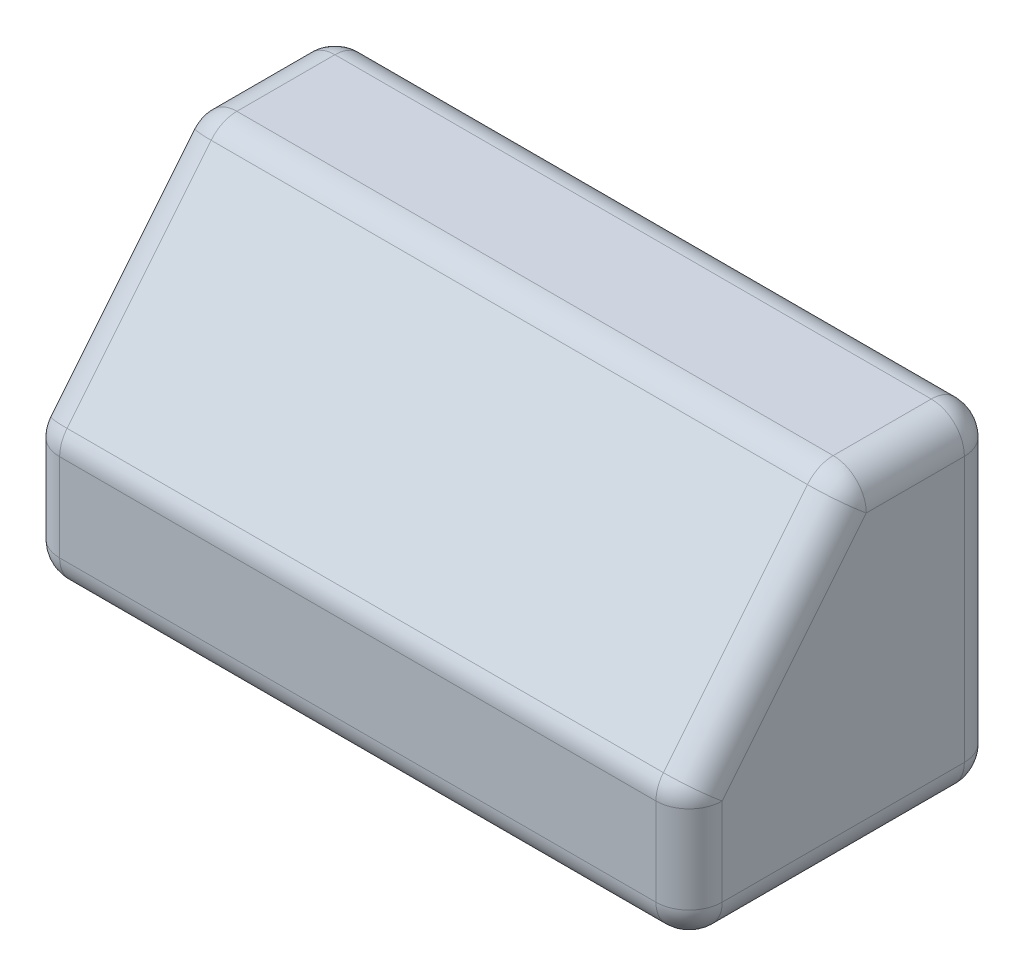
ISO-10303-21;
HEADER;
FILE_DESCRIPTION(('STEP AP214'),'2;1');
FILE_NAME('part.step','',(''),(''),'','','');
FILE_SCHEMA(('AUTOMOTIVE_DESIGN { 1 0 10303 214 1 1 1 1 }'));
ENDSEC;
DATA;
#1=APPLICATION_CONTEXT('core data for automotive mechanical design processes');
#2=APPLICATION_PROTOCOL_DEFINITION('international standard','automotive_design',2000,#1);
#3=PRODUCT_CONTEXT('',#1,'mechanical');
#4=PRODUCT('Part','Part','',(#3));
#5=PRODUCT_RELATED_PRODUCT_CATEGORY('part','',(#4));
#6=PRODUCT_DEFINITION_FORMATION('','',#4);
#7=PRODUCT_DEFINITION_CONTEXT('part definition',#1,'design');
#8=PRODUCT_DEFINITION('design','',#6,#7);
#9=PRODUCT_DEFINITION_SHAPE('','',#8);
#10=(LENGTH_UNIT() NAMED_UNIT(*) SI_UNIT(.MILLI.,.METRE.));
#11=(NAMED_UNIT(*) PLANE_ANGLE_UNIT() SI_UNIT($,.RADIAN.));
#12=(NAMED_UNIT(*) SI_UNIT($,.STERADIAN.) SOLID_ANGLE_UNIT());
#13=UNCERTAINTY_MEASURE_WITH_UNIT(LENGTH_MEASURE(1.E-05),#10,'distance_accuracy_value','');
#14=(GEOMETRIC_REPRESENTATION_CONTEXT(3) GLOBAL_UNCERTAINTY_ASSIGNED_CONTEXT((#13)) GLOBAL_UNIT_ASSIGNED_CONTEXT((#10,
#11,#12)) REPRESENTATION_CONTEXT('',''));
#15=CARTESIAN_POINT('',(0.,0.,0.));
#16=DIRECTION('',(0.,0.,1.));
#17=DIRECTION('',(1.,0.,0.));
#18=AXIS2_PLACEMENT_3D('',#15,#16,#17);
#19=CARTESIAN_POINT('',(127.,140.462,103.680401501193));
#20=DIRECTION('',(0.,0.,-1.));
#21=DIRECTION('',(-1.,0.,0.));
#22=AXIS2_PLACEMENT_3D('',#19,#20,#21);
#23=PLANE('',#22);
#24=DIRECTION('',(0.,-1.,0.));
#25=VECTOR('',#24,1.);
#26=CARTESIAN_POINT('',(-114.3,140.462,103.680401501193));
#27=LINE('',#26,#25);
#28=CARTESIAN_POINT('',(-114.3,135.953726858642,103.680401501193));
#29=VERTEX_POINT('',#28);
#30=CARTESIAN_POINT('',(-114.3,102.362,103.680401501193));
#31=VERTEX_POINT('',#30);
#32=EDGE_CURVE('E182',#29,#31,#27,.T.);
#33=ORIENTED_EDGE('',*,*,#32,.T.);
#34=DIRECTION('',(-1.,0.,0.));
#35=VECTOR('',#34,1.);
#36=CARTESIAN_POINT('',(127.,102.362,103.680401501193));
#37=LINE('',#36,#35);
#38=CARTESIAN_POINT('',(114.3,102.362,103.680401501193));
#39=VERTEX_POINT('',#38);
#40=EDGE_CURVE('E180',#31,#39,#37,.F.);
#41=ORIENTED_EDGE('',*,*,#40,.T.);
#42=DIRECTION('',(0.,-1.,0.));
#43=VECTOR('',#42,1.);
#44=CARTESIAN_POINT('',(114.3,140.462,103.680401501193));
#45=LINE('',#44,#43);
#46=CARTESIAN_POINT('',(114.3,135.953726858642,103.680401501193));
#47=VERTEX_POINT('',#46);
#48=EDGE_CURVE('E173',#39,#47,#45,.F.);
#49=ORIENTED_EDGE('',*,*,#48,.T.);
#50=DIRECTION('',(-1.,0.,0.));
#51=VECTOR('',#50,1.);
#52=CARTESIAN_POINT('',(127.,135.953726858642,103.680401501193));
#53=LINE('',#52,#51);
#54=EDGE_CURVE('E177',#47,#29,#53,.T.);
#55=ORIENTED_EDGE('',*,*,#54,.T.);
#56=EDGE_LOOP('',(#33,#41,#49,#55));
#57=FACE_BOUND('',#56,.T.);
#58=ADVANCED_FACE('F64',(#57),#23,.F.);
#59=CARTESIAN_POINT('',(127.,89.662,103.680401501193));
#60=DIRECTION('',(0.,1.,0.));
#61=DIRECTION('',(0.,0.,1.));
#62=AXIS2_PLACEMENT_3D('',#59,#60,#61);
#63=PLANE('',#62);
#64=DIRECTION('',(0.,0.,-1.));
#65=VECTOR('',#64,1.);
#66=CARTESIAN_POINT('',(-114.3,89.662,103.680401501193));
#67=LINE('',#66,#65);
#68=CARTESIAN_POINT('',(-114.3,89.662,90.9804015011929));
#69=VERTEX_POINT('',#68);
#70=CARTESIAN_POINT('',(-114.3,89.662,-1.84700646578063));
#71=VERTEX_POINT('',#70);
#72=EDGE_CURVE('E227',#69,#71,#67,.T.);
#73=ORIENTED_EDGE('',*,*,#72,.T.);
#74=DIRECTION('',(-1.,0.,0.));
#75=VECTOR('',#74,1.);
#76=CARTESIAN_POINT('',(127.,89.662,-1.84700646578063));
#77=LINE('',#76,#75);
#78=CARTESIAN_POINT('',(114.3,89.662,-1.84700646578063));
#79=VERTEX_POINT('',#78);
#80=EDGE_CURVE('E230',#71,#79,#77,.F.);
#81=ORIENTED_EDGE('',*,*,#80,.T.);
#82=DIRECTION('',(0.,0.,-1.));
#83=VECTOR('',#82,1.);
#84=CARTESIAN_POINT('',(114.3,89.662,103.680401501193));
#85=LINE('',#84,#83);
#86=CARTESIAN_POINT('',(114.3,89.662,90.9804015011929));
#87=VERTEX_POINT('',#86);
#88=EDGE_CURVE('E225',#79,#87,#85,.F.);
#89=ORIENTED_EDGE('',*,*,#88,.T.);
#90=DIRECTION('',(-1.,0.,0.));
#91=VECTOR('',#90,1.);
#92=CARTESIAN_POINT('',(127.,89.662,90.9804015011929));
#93=LINE('',#92,#91);
#94=EDGE_CURVE('E223',#87,#69,#93,.T.);
#95=ORIENTED_EDGE('',*,*,#94,.T.);
#96=EDGE_LOOP('',(#73,#81,#89,#95));
#97=FACE_BOUND('',#96,.T.);
#98=ADVANCED_FACE('F424',(#97),#63,.F.);
#99=CARTESIAN_POINT('',(127.,89.662,-14.5470064657806));
#100=DIRECTION('',(0.,0.,1.));
#101=DIRECTION('',(1.,0.,0.));
#102=AXIS2_PLACEMENT_3D('',#99,#100,#101);
#103=PLANE('',#102);
#104=DIRECTION('',(0.,1.,0.));
#105=VECTOR('',#104,1.);
#106=CARTESIAN_POINT('',(-114.3,89.662,-14.5470064657806));
#107=LINE('',#106,#105);
#108=CARTESIAN_POINT('',(-114.3,102.362,-14.5470064657806));
#109=VERTEX_POINT('',#108);
#110=CARTESIAN_POINT('',(-114.3,203.962,-14.5470064657806));
#111=VERTEX_POINT('',#110);
#112=EDGE_CURVE('E236',#109,#111,#107,.T.);
#113=ORIENTED_EDGE('',*,*,#112,.T.);
#114=DIRECTION('',(-1.,0.,0.));
#115=VECTOR('',#114,1.);
#116=CARTESIAN_POINT('',(127.,203.962,-14.5470064657806));
#117=LINE('',#116,#115);
#118=CARTESIAN_POINT('',(114.3,203.962,-14.5470064657806));
#119=VERTEX_POINT('',#118);
#120=EDGE_CURVE('E239',#111,#119,#117,.F.);
#121=ORIENTED_EDGE('',*,*,#120,.T.);
#122=DIRECTION('',(0.,1.,0.));
#123=VECTOR('',#122,1.);
#124=CARTESIAN_POINT('',(114.3,89.662,-14.5470064657806));
#125=LINE('',#124,#123);
#126=CARTESIAN_POINT('',(114.3,102.362,-14.5470064657806));
#127=VERTEX_POINT('',#126);
#128=EDGE_CURVE('E234',#119,#127,#125,.F.);
#129=ORIENTED_EDGE('',*,*,#128,.T.);
#130=DIRECTION('',(-1.,0.,0.));
#131=VECTOR('',#130,1.);
#132=CARTESIAN_POINT('',(127.,102.362,-14.5470064657806));
#133=LINE('',#132,#131);
#134=EDGE_CURVE('E232',#127,#109,#133,.T.);
#135=ORIENTED_EDGE('',*,*,#134,.T.);
#136=EDGE_LOOP('',(#113,#121,#129,#135));
#137=FACE_BOUND('',#136,.T.);
#138=ADVANCED_FACE('F389',(#137),#103,.F.);
#139=CARTESIAN_POINT('',(127.,216.662,-14.5470064657806));
#140=DIRECTION('',(0.,-1.,0.));
#141=DIRECTION('',(0.,0.,-1.));
#142=AXIS2_PLACEMENT_3D('',#139,#140,#141);
#143=PLANE('',#142);
#144=DIRECTION('',(0.,0.,1.));
#145=VECTOR('',#144,1.);
#146=CARTESIAN_POINT('',(-114.3,216.662,-14.5470064657806));
#147=LINE('',#146,#145);
#148=CARTESIAN_POINT('',(-114.3,216.662,-1.84700646578063));
#149=VERTEX_POINT('',#148);
#150=CARTESIAN_POINT('',(-114.3,216.662,35.7354074828247));
#151=VERTEX_POINT('',#150);
#152=EDGE_CURVE('E245',#149,#151,#147,.T.);
#153=ORIENTED_EDGE('',*,*,#152,.T.);
#154=DIRECTION('',(-1.,0.,0.));
#155=VECTOR('',#154,1.);
#156=CARTESIAN_POINT('',(127.,216.662,35.7354074828247));
#157=LINE('',#156,#155);
#158=CARTESIAN_POINT('',(114.3,216.662,35.7354074828247));
#159=VERTEX_POINT('',#158);
#160=EDGE_CURVE('E248',#151,#159,#157,.F.);
#161=ORIENTED_EDGE('',*,*,#160,.T.);
#162=DIRECTION('',(0.,0.,1.));
#163=VECTOR('',#162,1.);
#164=CARTESIAN_POINT('',(114.3,216.662,-14.5470064657806));
#165=LINE('',#164,#163);
#166=CARTESIAN_POINT('',(114.3,216.662,-1.84700646578063));
#167=VERTEX_POINT('',#166);
#168=EDGE_CURVE('E243',#159,#167,#165,.F.);
#169=ORIENTED_EDGE('',*,*,#168,.T.);
#170=DIRECTION('',(-1.,0.,0.));
#171=VECTOR('',#170,1.);
#172=CARTESIAN_POINT('',(127.,216.662,-1.84700646578063));
#173=LINE('',#172,#171);
#174=EDGE_CURVE('E241',#167,#149,#173,.T.);
#175=ORIENTED_EDGE('',*,*,#174,.T.);
#176=EDGE_LOOP('',(#153,#161,#169,#175));
#177=FACE_BOUND('',#176,.T.);
#178=ADVANCED_FACE('F405',(#177),#143,.F.);
#179=CARTESIAN_POINT('',(127.,216.662,41.7810420592956));
#180=DIRECTION('',(0.,-0.630511996261592,-0.776179504090531));
#181=DIRECTION('',(0.,0.776179504090531,-0.630511996261592));
#182=AXIS2_PLACEMENT_3D('',#179,#180,#181);
#183=PLANE('',#182);
#184=DIRECTION('',(0.,-0.776179504090531,0.630511996261592));
#185=VECTOR('',#184,1.);
#186=CARTESIAN_POINT('',(114.3,216.662,41.7810420592956));
#187=LINE('',#186,#185);
#188=CARTESIAN_POINT('',(114.3,143.961229211164,100.837881203143));
#189=VERTEX_POINT('',#188);
#190=CARTESIAN_POINT('',(114.3,211.969502352522,45.5928871847744));
#191=VERTEX_POINT('',#190);
#192=EDGE_CURVE('E252',#189,#191,#187,.F.);
#193=ORIENTED_EDGE('',*,*,#192,.T.);
#194=DIRECTION('',(-1.,0.,0.));
#195=VECTOR('',#194,1.);
#196=CARTESIAN_POINT('',(127.,211.969502352522,45.5928871847744));
#197=LINE('',#196,#195);
#198=CARTESIAN_POINT('',(-114.3,211.969502352522,45.5928871847744));
#199=VERTEX_POINT('',#198);
#200=EDGE_CURVE('E257',#191,#199,#197,.T.);
#201=ORIENTED_EDGE('',*,*,#200,.T.);
#202=DIRECTION('',(0.,-0.776179504090531,0.630511996261592));
#203=VECTOR('',#202,1.);
#204=CARTESIAN_POINT('',(-114.3,216.662,41.7810420592956));
#205=LINE('',#204,#203);
#206=CARTESIAN_POINT('',(-114.3,143.961229211164,100.837881203143));
#207=VERTEX_POINT('',#206);
#208=EDGE_CURVE('E254',#199,#207,#205,.T.);
#209=ORIENTED_EDGE('',*,*,#208,.T.);
#210=DIRECTION('',(-1.,0.,0.));
#211=VECTOR('',#210,1.);
#212=CARTESIAN_POINT('',(127.,143.961229211164,100.837881203143));
#213=LINE('',#212,#211);
#214=EDGE_CURVE('E250',#207,#189,#213,.F.);
#215=ORIENTED_EDGE('',*,*,#214,.T.);
#216=EDGE_LOOP('',(#193,#201,#209,#215));
#217=FACE_BOUND('',#216,.T.);
#218=ADVANCED_FACE('F351',(#217),#183,.F.);
#219=CARTESIAN_POINT('',(127.,0.,0.));
#220=DIRECTION('',(1.,0.,0.));
#221=DIRECTION('',(0.,0.,-1.));
#222=AXIS2_PLACEMENT_3D('',#219,#220,#221);
#223=PLANE('',#222);
#224=DIRECTION('',(0.,-0.776179504090531,0.630511996261592));
#225=VECTOR('',#224,1.);
#226=CARTESIAN_POINT('',(127.,132.454497647478,93.8229217992432));
#227=LINE('',#226,#225);
#228=CARTESIAN_POINT('',(127.,203.962,35.7354074828247));
#229=VERTEX_POINT('',#228);
#230=CARTESIAN_POINT('',(127.,135.953726858642,90.9804015011929));
#231=VERTEX_POINT('',#230);
#232=EDGE_CURVE('E259',#229,#231,#227,.T.);
#233=ORIENTED_EDGE('',*,*,#232,.T.);
#234=DIRECTION('',(0.,-1.,0.));
#235=VECTOR('',#234,1.);
#236=CARTESIAN_POINT('',(127.,89.662,90.9804015011929));
#237=LINE('',#236,#235);
#238=CARTESIAN_POINT('',(127.,102.362,90.9804015011929));
#239=VERTEX_POINT('',#238);
#240=EDGE_CURVE('E12',#231,#239,#237,.T.);
#241=ORIENTED_EDGE('',*,*,#240,.T.);
#242=DIRECTION('',(0.,0.,-1.));
#243=VECTOR('',#242,1.);
#244=CARTESIAN_POINT('',(127.,102.362,-14.5470064657806));
#245=LINE('',#244,#243);
#246=CARTESIAN_POINT('',(127.,102.362,-1.84700646578063));
#247=VERTEX_POINT('',#246);
#248=EDGE_CURVE('E73',#239,#247,#245,.T.);
#249=ORIENTED_EDGE('',*,*,#248,.T.);
#250=DIRECTION('',(0.,1.,0.));
#251=VECTOR('',#250,1.);
#252=CARTESIAN_POINT('',(127.,216.662,-1.84700646578063));
#253=LINE('',#252,#251);
#254=CARTESIAN_POINT('',(127.,203.962,-1.84700646578063));
#255=VERTEX_POINT('',#254);
#256=EDGE_CURVE('E263',#247,#255,#253,.T.);
#257=ORIENTED_EDGE('',*,*,#256,.T.);
#258=DIRECTION('',(0.,0.,1.));
#259=VECTOR('',#258,1.);
#260=CARTESIAN_POINT('',(127.,203.962,41.7810420592956));
#261=LINE('',#260,#259);
#262=EDGE_CURVE('E261',#255,#229,#261,.T.);
#263=ORIENTED_EDGE('',*,*,#262,.T.);
#264=EDGE_LOOP('',(#233,#241,#249,#257,#263));
#265=FACE_BOUND('',#264,.T.);
#266=ADVANCED_FACE('F344',(#265),#223,.T.);
#267=CARTESIAN_POINT('',(-127.,0.,0.));
#268=DIRECTION('',(1.,0.,0.));
#269=DIRECTION('',(0.,0.,-1.));
#270=AXIS2_PLACEMENT_3D('',#267,#268,#269);
#271=PLANE('',#270);
#272=DIRECTION('',(0.,0.,-1.));
#273=VECTOR('',#272,1.);
#274=CARTESIAN_POINT('',(-127.,102.362,0.));
#275=LINE('',#274,#273);
#276=CARTESIAN_POINT('',(-127.,102.362,-1.84700646578063));
#277=VERTEX_POINT('',#276);
#278=CARTESIAN_POINT('',(-127.,102.362,90.9804015011929));
#279=VERTEX_POINT('',#278);
#280=EDGE_CURVE('E218',#277,#279,#275,.F.);
#281=ORIENTED_EDGE('',*,*,#280,.T.);
#282=DIRECTION('',(0.,-1.,0.));
#283=VECTOR('',#282,1.);
#284=CARTESIAN_POINT('',(-127.,0.,90.9804015011929));
#285=LINE('',#284,#283);
#286=CARTESIAN_POINT('',(-127.,135.953726858642,90.9804015011929));
#287=VERTEX_POINT('',#286);
#288=EDGE_CURVE('E220',#279,#287,#285,.F.);
#289=ORIENTED_EDGE('',*,*,#288,.T.);
#290=DIRECTION('',(0.,-0.776179504090531,0.630511996261592));
#291=VECTOR('',#290,1.);
#292=CARTESIAN_POINT('',(-127.,98.5727187990093,121.346024259509));
#293=LINE('',#292,#291);
#294=CARTESIAN_POINT('',(-127.,203.962,35.7354074828247));
#295=VERTEX_POINT('',#294);
#296=EDGE_CURVE('E212',#287,#295,#293,.F.);
#297=ORIENTED_EDGE('',*,*,#296,.T.);
#298=DIRECTION('',(0.,0.,1.));
#299=VECTOR('',#298,1.);
#300=CARTESIAN_POINT('',(-127.,203.962,0.));
#301=LINE('',#300,#299);
#302=CARTESIAN_POINT('',(-127.,203.962,-1.84700646578063));
#303=VERTEX_POINT('',#302);
#304=EDGE_CURVE('E214',#295,#303,#301,.F.);
#305=ORIENTED_EDGE('',*,*,#304,.T.);
#306=DIRECTION('',(0.,1.,0.));
#307=VECTOR('',#306,1.);
#308=CARTESIAN_POINT('',(-127.,0.,-1.84700646578063));
#309=LINE('',#308,#307);
#310=EDGE_CURVE('E216',#303,#277,#309,.F.);
#311=ORIENTED_EDGE('',*,*,#310,.T.);
#312=EDGE_LOOP('',(#281,#289,#297,#305,#311));
#313=FACE_BOUND('',#312,.T.);
#314=ADVANCED_FACE('F418',(#313),#271,.F.);
#315=CARTESIAN_POINT('',(114.3,203.962,-1.84700646578063));
#316=DIRECTION('',(1.,0.,0.));
#317=DIRECTION('',(0.,0.,-1.));
#318=AXIS2_PLACEMENT_3D('',#315,#316,#317);
#319=SPHERICAL_SURFACE('',#318,12.7);
#320=CARTESIAN_POINT('',(114.3,203.962,-1.84700646578063));
#321=DIRECTION('',(1.,0.,0.));
#322=DIRECTION('',(0.,0.,-1.));
#323=AXIS2_PLACEMENT_3D('',#320,#321,#322);
#324=CIRCLE('',#323,12.7);
#325=EDGE_CURVE('E326',#167,#119,#324,.F.);
#326=ORIENTED_EDGE('',*,*,#325,.F.);
#327=CARTESIAN_POINT('',(114.3,203.962,-1.84700646578063));
#328=DIRECTION('',(0.,0.,-1.));
#329=DIRECTION('',(-1.,0.,0.));
#330=AXIS2_PLACEMENT_3D('',#327,#328,#329);
#331=CIRCLE('',#330,12.7);
#332=EDGE_CURVE('E68',#255,#167,#331,.F.);
#333=ORIENTED_EDGE('',*,*,#332,.F.);
#334=CARTESIAN_POINT('',(114.3,203.962,-1.84700646578063));
#335=DIRECTION('',(0.,1.,0.));
#336=DIRECTION('',(0.,0.,1.));
#337=AXIS2_PLACEMENT_3D('',#334,#335,#336);
#338=CIRCLE('',#337,12.7);
#339=EDGE_CURVE('E208',#119,#255,#338,.F.);
#340=ORIENTED_EDGE('',*,*,#339,.F.);
#341=EDGE_LOOP('',(#326,#333,#340));
#342=FACE_BOUND('',#341,.T.);
#343=ADVANCED_FACE('F66',(#342),#319,.T.);
#344=CARTESIAN_POINT('',(114.3,203.962,0.));
#345=DIRECTION('',(0.,0.,-1.));
#346=DIRECTION('',(-1.,0.,0.));
#347=AXIS2_PLACEMENT_3D('',#344,#345,#346);
#348=CYLINDRICAL_SURFACE('',#347,12.7);
#349=ORIENTED_EDGE('',*,*,#332,.T.);
#350=ORIENTED_EDGE('',*,*,#168,.F.);
#351=CARTESIAN_POINT('',(114.3,203.962,35.7354074828247));
#352=DIRECTION('',(0.,0.,1.));
#353=DIRECTION('',(1.,0.,0.));
#354=AXIS2_PLACEMENT_3D('',#351,#352,#353);
#355=CIRCLE('',#354,12.7);
#356=EDGE_CURVE('E323',#229,#159,#355,.T.);
#357=ORIENTED_EDGE('',*,*,#356,.F.);
#358=ORIENTED_EDGE('',*,*,#262,.F.);
#359=EDGE_LOOP('',(#349,#350,#357,#358));
#360=FACE_BOUND('',#359,.T.);
#361=ADVANCED_FACE('F342',(#360),#348,.T.);
#362=CARTESIAN_POINT('',(114.3,0.,-1.84700646578063));
#363=DIRECTION('',(0.,-1.,0.));
#364=DIRECTION('',(0.,0.,-1.));
#365=AXIS2_PLACEMENT_3D('',#362,#363,#364);
#366=CYLINDRICAL_SURFACE('',#365,12.7);
#367=ORIENTED_EDGE('',*,*,#339,.T.);
#368=ORIENTED_EDGE('',*,*,#256,.F.);
#369=CARTESIAN_POINT('',(114.3,102.362,-1.84700646578063));
#370=DIRECTION('',(0.,-1.,0.));
#371=DIRECTION('',(0.,0.,-1.));
#372=AXIS2_PLACEMENT_3D('',#369,#370,#371);
#373=CIRCLE('',#372,12.7);
#374=EDGE_CURVE('E320',#127,#247,#373,.T.);
#375=ORIENTED_EDGE('',*,*,#374,.F.);
#376=ORIENTED_EDGE('',*,*,#128,.F.);
#377=EDGE_LOOP('',(#367,#368,#375,#376));
#378=FACE_BOUND('',#377,.T.);
#379=ADVANCED_FACE('F333',(#378),#366,.T.);
#380=CARTESIAN_POINT('',(127.,203.962,-1.84700646578063));
#381=DIRECTION('',(-1.,0.,0.));
#382=DIRECTION('',(0.,0.,1.));
#383=AXIS2_PLACEMENT_3D('',#380,#381,#382);
#384=CYLINDRICAL_SURFACE('',#383,12.7);
#385=ORIENTED_EDGE('',*,*,#325,.T.);
#386=ORIENTED_EDGE('',*,*,#120,.F.);
#387=CARTESIAN_POINT('',(-114.3,203.962,-1.84700646578063));
#388=DIRECTION('',(-1.,0.,0.));
#389=DIRECTION('',(0.,0.,1.));
#390=AXIS2_PLACEMENT_3D('',#387,#388,#389);
#391=CIRCLE('',#390,12.7);
#392=EDGE_CURVE('E317',#149,#111,#391,.T.);
#393=ORIENTED_EDGE('',*,*,#392,.F.);
#394=ORIENTED_EDGE('',*,*,#174,.F.);
#395=EDGE_LOOP('',(#385,#386,#393,#394));
#396=FACE_BOUND('',#395,.T.);
#397=ADVANCED_FACE('F403',(#396),#384,.T.);
#398=CARTESIAN_POINT('',(114.3,203.962,35.7354074828247));
#399=DIRECTION('',(1.,0.,0.));
#400=DIRECTION('',(0.,0.,-1.));
#401=AXIS2_PLACEMENT_3D('',#398,#399,#400);
#402=SPHERICAL_SURFACE('',#401,12.7);
#403=CARTESIAN_POINT('',(114.3,203.962,35.7354074828247));
#404=DIRECTION('',(0.,0.77617950409053,-0.630511996261593));
#405=DIRECTION('',(0.,0.630511996261593,0.77617950409053));
#406=AXIS2_PLACEMENT_3D('',#403,#404,#405);
#407=CIRCLE('',#406,12.7);
#408=EDGE_CURVE('E308',#229,#191,#407,.F.);
#409=ORIENTED_EDGE('',*,*,#408,.F.);
#410=ORIENTED_EDGE('',*,*,#356,.T.);
#411=CARTESIAN_POINT('',(114.3,203.962,35.7354074828247));
#412=DIRECTION('',(1.,0.,0.));
#413=DIRECTION('',(0.,0.,-1.));
#414=AXIS2_PLACEMENT_3D('',#411,#412,#413);
#415=CIRCLE('',#414,12.7);
#416=EDGE_CURVE('E311',#191,#159,#415,.F.);
#417=ORIENTED_EDGE('',*,*,#416,.F.);
#418=EDGE_LOOP('',(#409,#410,#417));
#419=FACE_BOUND('',#418,.T.);
#420=ADVANCED_FACE('F408',(#419),#402,.T.);
#421=CARTESIAN_POINT('',(114.3,102.362,-1.84700646578063));
#422=DIRECTION('',(1.,0.,0.));
#423=DIRECTION('',(0.,0.,-1.));
#424=AXIS2_PLACEMENT_3D('',#421,#422,#423);
#425=SPHERICAL_SURFACE('',#424,12.7);
#426=CARTESIAN_POINT('',(114.3,102.362,-1.84700646578063));
#427=DIRECTION('',(1.,0.,0.));
#428=DIRECTION('',(0.,0.,-1.));
#429=AXIS2_PLACEMENT_3D('',#426,#427,#428);
#430=CIRCLE('',#429,12.7);
#431=EDGE_CURVE('E302',#127,#79,#430,.F.);
#432=ORIENTED_EDGE('',*,*,#431,.F.);
#433=ORIENTED_EDGE('',*,*,#374,.T.);
#434=CARTESIAN_POINT('',(114.3,102.362,-1.84700646578063));
#435=DIRECTION('',(0.,0.,-1.));
#436=DIRECTION('',(-1.,0.,0.));
#437=AXIS2_PLACEMENT_3D('',#434,#435,#436);
#438=CIRCLE('',#437,12.7);
#439=EDGE_CURVE('E305',#79,#247,#438,.F.);
#440=ORIENTED_EDGE('',*,*,#439,.F.);
#441=EDGE_LOOP('',(#432,#433,#440));
#442=FACE_BOUND('',#441,.T.);
#443=ADVANCED_FACE('F381',(#442),#425,.T.);
#444=CARTESIAN_POINT('',(-114.3,203.962,-1.84700646578063));
#445=DIRECTION('',(0.,1.,0.));
#446=DIRECTION('',(-1.,0.,0.));
#447=AXIS2_PLACEMENT_3D('',#444,#445,#446);
#448=SPHERICAL_SURFACE('',#447,12.7);
#449=CARTESIAN_POINT('',(-114.3,203.962,-1.84700646578063));
#450=DIRECTION('',(0.,1.,0.));
#451=DIRECTION('',(0.,0.,1.));
#452=AXIS2_PLACEMENT_3D('',#449,#450,#451);
#453=CIRCLE('',#452,12.7);
#454=EDGE_CURVE('E300',#303,#111,#453,.F.);
#455=ORIENTED_EDGE('',*,*,#454,.F.);
#456=CARTESIAN_POINT('',(-114.3,203.962,-1.84700646578063));
#457=DIRECTION('',(0.,0.,-1.));
#458=DIRECTION('',(-1.,0.,0.));
#459=AXIS2_PLACEMENT_3D('',#456,#457,#458);
#460=CIRCLE('',#459,12.7);
#461=EDGE_CURVE('E314',#149,#303,#460,.F.);
#462=ORIENTED_EDGE('',*,*,#461,.F.);
#463=ORIENTED_EDGE('',*,*,#392,.T.);
#464=EDGE_LOOP('',(#455,#462,#463));
#465=FACE_BOUND('',#464,.T.);
#466=ADVANCED_FACE('F400',(#465),#448,.T.);
#467=CARTESIAN_POINT('',(-114.3,203.962,-14.5470064657806));
#468=DIRECTION('',(0.,0.,1.));
#469=DIRECTION('',(1.,0.,0.));
#470=AXIS2_PLACEMENT_3D('',#467,#468,#469);
#471=CYLINDRICAL_SURFACE('',#470,12.7);
#472=ORIENTED_EDGE('',*,*,#461,.T.);
#473=ORIENTED_EDGE('',*,*,#304,.F.);
#474=CARTESIAN_POINT('',(-114.3,203.962,35.7354074828247));
#475=DIRECTION('',(0.,0.,1.));
#476=DIRECTION('',(1.,0.,0.));
#477=AXIS2_PLACEMENT_3D('',#474,#475,#476);
#478=CIRCLE('',#477,12.7);
#479=EDGE_CURVE('E297',#151,#295,#478,.T.);
#480=ORIENTED_EDGE('',*,*,#479,.F.);
#481=ORIENTED_EDGE('',*,*,#152,.F.);
#482=EDGE_LOOP('',(#472,#473,#480,#481));
#483=FACE_BOUND('',#482,.T.);
#484=ADVANCED_FACE('F416',(#483),#471,.T.);
#485=CARTESIAN_POINT('',(127.,203.962,35.7354074828247));
#486=DIRECTION('',(-1.,0.,0.));
#487=DIRECTION('',(0.,0.,1.));
#488=AXIS2_PLACEMENT_3D('',#485,#486,#487);
#489=CYLINDRICAL_SURFACE('',#488,12.7);
#490=ORIENTED_EDGE('',*,*,#416,.T.);
#491=ORIENTED_EDGE('',*,*,#160,.F.);
#492=CARTESIAN_POINT('',(-114.3,203.962,35.7354074828247));
#493=DIRECTION('',(-1.,0.,0.));
#494=DIRECTION('',(0.,0.,1.));
#495=AXIS2_PLACEMENT_3D('',#492,#493,#494);
#496=CIRCLE('',#495,12.7);
#497=EDGE_CURVE('E295',#199,#151,#496,.T.);
#498=ORIENTED_EDGE('',*,*,#497,.F.);
#499=ORIENTED_EDGE('',*,*,#200,.F.);
#500=EDGE_LOOP('',(#490,#491,#498,#499));
#501=FACE_BOUND('',#500,.T.);
#502=ADVANCED_FACE('F410',(#501),#489,.T.);
#503=CARTESIAN_POINT('',(114.3,98.5727187990093,121.346024259509));
#504=DIRECTION('',(0.,0.776179504090531,-0.630511996261592));
#505=DIRECTION('',(0.,0.630511996261592,0.776179504090531));
#506=AXIS2_PLACEMENT_3D('',#503,#504,#505);
#507=CYLINDRICAL_SURFACE('',#506,12.7);
#508=ORIENTED_EDGE('',*,*,#408,.T.);
#509=ORIENTED_EDGE('',*,*,#192,.F.);
#510=CARTESIAN_POINT('',(114.3,135.953726858642,90.9804015011929));
#511=DIRECTION('',(0.,-0.776179504090531,0.630511996261591));
#512=DIRECTION('',(0.,-0.630511996261592,-0.776179504090531));
#513=AXIS2_PLACEMENT_3D('',#510,#511,#512);
#514=CIRCLE('',#513,12.7);
#515=EDGE_CURVE('E192',#231,#189,#514,.T.);
#516=ORIENTED_EDGE('',*,*,#515,.F.);
#517=ORIENTED_EDGE('',*,*,#232,.F.);
#518=EDGE_LOOP('',(#508,#509,#516,#517));
#519=FACE_BOUND('',#518,.T.);
#520=ADVANCED_FACE('F347',(#519),#507,.T.);
#521=CARTESIAN_POINT('',(114.3,0.,90.9804015011929));
#522=DIRECTION('',(0.,1.,0.));
#523=DIRECTION('',(0.,0.,1.));
#524=AXIS2_PLACEMENT_3D('',#521,#522,#523);
#525=CYLINDRICAL_SURFACE('',#524,12.7);
#526=CARTESIAN_POINT('',(114.3,102.362,90.9804015011929));
#527=DIRECTION('',(0.,-1.,0.));
#528=DIRECTION('',(0.,0.,-1.));
#529=AXIS2_PLACEMENT_3D('',#526,#527,#528);
#530=CIRCLE('',#529,12.7);
#531=EDGE_CURVE('E193',#239,#39,#530,.T.);
#532=ORIENTED_EDGE('',*,*,#531,.F.);
#533=ORIENTED_EDGE('',*,*,#240,.F.);
#534=CARTESIAN_POINT('',(114.3,135.953726858642,90.9804015011929));
#535=DIRECTION('',(0.,1.,0.));
#536=DIRECTION('',(0.,0.,1.));
#537=AXIS2_PLACEMENT_3D('',#534,#535,#536);
#538=CIRCLE('',#537,12.7);
#539=EDGE_CURVE('E186',#47,#231,#538,.T.);
#540=ORIENTED_EDGE('',*,*,#539,.F.);
#541=ORIENTED_EDGE('',*,*,#48,.F.);
#542=EDGE_LOOP('',(#532,#533,#540,#541));
#543=FACE_BOUND('',#542,.T.);
#544=ADVANCED_FACE('F188',(#543),#525,.T.);
#545=CARTESIAN_POINT('',(114.3,102.362,0.));
#546=DIRECTION('',(0.,0.,1.));
#547=DIRECTION('',(1.,0.,0.));
#548=AXIS2_PLACEMENT_3D('',#545,#546,#547);
#549=CYLINDRICAL_SURFACE('',#548,12.7);
#550=ORIENTED_EDGE('',*,*,#439,.T.);
#551=ORIENTED_EDGE('',*,*,#248,.F.);
#552=CARTESIAN_POINT('',(114.3,102.362,90.9804015011929));
#553=DIRECTION('',(0.,0.,1.));
#554=DIRECTION('',(1.,0.,0.));
#555=AXIS2_PLACEMENT_3D('',#552,#553,#554);
#556=CIRCLE('',#555,12.7);
#557=EDGE_CURVE('E81',#87,#239,#556,.T.);
#558=ORIENTED_EDGE('',*,*,#557,.F.);
#559=ORIENTED_EDGE('',*,*,#88,.F.);
#560=EDGE_LOOP('',(#550,#551,#558,#559));
#561=FACE_BOUND('',#560,.T.);
#562=ADVANCED_FACE('F376',(#561),#549,.T.);
#563=CARTESIAN_POINT('',(127.,102.362,-1.84700646578063));
#564=DIRECTION('',(-1.,0.,0.));
#565=DIRECTION('',(0.,0.,1.));
#566=AXIS2_PLACEMENT_3D('',#563,#564,#565);
#567=CYLINDRICAL_SURFACE('',#566,12.7);
#568=ORIENTED_EDGE('',*,*,#431,.T.);
#569=ORIENTED_EDGE('',*,*,#80,.F.);
#570=CARTESIAN_POINT('',(-114.3,102.362,-1.84700646578063));
#571=DIRECTION('',(-1.,0.,0.));
#572=DIRECTION('',(0.,0.,1.));
#573=AXIS2_PLACEMENT_3D('',#570,#571,#572);
#574=CIRCLE('',#573,12.7);
#575=EDGE_CURVE('E289',#109,#71,#574,.T.);
#576=ORIENTED_EDGE('',*,*,#575,.F.);
#577=ORIENTED_EDGE('',*,*,#134,.F.);
#578=EDGE_LOOP('',(#568,#569,#576,#577));
#579=FACE_BOUND('',#578,.T.);
#580=ADVANCED_FACE('F386',(#579),#567,.T.);
#581=CARTESIAN_POINT('',(-114.3,89.662,-1.84700646578063));
#582=DIRECTION('',(0.,1.,0.));
#583=DIRECTION('',(0.,0.,1.));
#584=AXIS2_PLACEMENT_3D('',#581,#582,#583);
#585=CYLINDRICAL_SURFACE('',#584,12.7);
#586=ORIENTED_EDGE('',*,*,#454,.T.);
#587=ORIENTED_EDGE('',*,*,#112,.F.);
#588=CARTESIAN_POINT('',(-114.3,102.362,-1.84700646578063));
#589=DIRECTION('',(0.,-1.,0.));
#590=DIRECTION('',(0.,0.,-1.));
#591=AXIS2_PLACEMENT_3D('',#588,#589,#590);
#592=CIRCLE('',#591,12.7);
#593=EDGE_CURVE('E286',#277,#109,#592,.T.);
#594=ORIENTED_EDGE('',*,*,#593,.F.);
#595=ORIENTED_EDGE('',*,*,#310,.F.);
#596=EDGE_LOOP('',(#586,#587,#594,#595));
#597=FACE_BOUND('',#596,.T.);
#598=ADVANCED_FACE('F392',(#597),#585,.T.);
#599=CARTESIAN_POINT('',(-114.3,203.962,35.7354074828247));
#600=DIRECTION('',(-1.,0.,0.));
#601=DIRECTION('',(0.,0.,1.));
#602=AXIS2_PLACEMENT_3D('',#599,#600,#601);
#603=SPHERICAL_SURFACE('',#602,12.7);
#604=ORIENTED_EDGE('',*,*,#497,.T.);
#605=ORIENTED_EDGE('',*,*,#479,.T.);
#606=CARTESIAN_POINT('',(-114.3,203.962,35.7354074828247));
#607=DIRECTION('',(0.,0.776179504090531,-0.630511996261592));
#608=DIRECTION('',(0.,0.630511996261592,0.776179504090531));
#609=AXIS2_PLACEMENT_3D('',#606,#607,#608);
#610=CIRCLE('',#609,12.7);
#611=EDGE_CURVE('E200',#199,#295,#610,.F.);
#612=ORIENTED_EDGE('',*,*,#611,.F.);
#613=EDGE_LOOP('',(#604,#605,#612));
#614=FACE_BOUND('',#613,.T.);
#615=ADVANCED_FACE('F413',(#614),#603,.T.);
#616=CARTESIAN_POINT('',(114.3,135.953726858642,90.9804015011929));
#617=DIRECTION('',(1.,0.,0.));
#618=DIRECTION('',(0.,0.,-1.));
#619=AXIS2_PLACEMENT_3D('',#616,#617,#618);
#620=SPHERICAL_SURFACE('',#619,12.7);
#621=ORIENTED_EDGE('',*,*,#539,.T.);
#622=ORIENTED_EDGE('',*,*,#515,.T.);
#623=CARTESIAN_POINT('',(114.3,135.953726858642,90.9804015011929));
#624=DIRECTION('',(1.,0.,0.));
#625=DIRECTION('',(0.,0.,-1.));
#626=AXIS2_PLACEMENT_3D('',#623,#624,#625);
#627=CIRCLE('',#626,12.7);
#628=EDGE_CURVE('E196',#47,#189,#627,.F.);
#629=ORIENTED_EDGE('',*,*,#628,.F.);
#630=EDGE_LOOP('',(#621,#622,#629));
#631=FACE_BOUND('',#630,.T.);
#632=ADVANCED_FACE('F197',(#631),#620,.T.);
#633=CARTESIAN_POINT('',(114.3,102.362,90.9804015011929));
#634=DIRECTION('',(1.,0.,0.));
#635=DIRECTION('',(0.,0.,-1.));
#636=AXIS2_PLACEMENT_3D('',#633,#634,#635);
#637=SPHERICAL_SURFACE('',#636,12.7);
#638=ORIENTED_EDGE('',*,*,#557,.T.);
#639=ORIENTED_EDGE('',*,*,#531,.T.);
#640=CARTESIAN_POINT('',(114.3,102.362,90.9804015011929));
#641=DIRECTION('',(1.,0.,0.));
#642=DIRECTION('',(0.,0.,-1.));
#643=AXIS2_PLACEMENT_3D('',#640,#641,#642);
#644=CIRCLE('',#643,12.7);
#645=EDGE_CURVE('E201',#87,#39,#644,.F.);
#646=ORIENTED_EDGE('',*,*,#645,.F.);
#647=EDGE_LOOP('',(#638,#639,#646));
#648=FACE_BOUND('',#647,.T.);
#649=ADVANCED_FACE('F374',(#648),#637,.T.);
#650=CARTESIAN_POINT('',(-114.3,102.362,-1.84700646578063));
#651=DIRECTION('',(0.,0.,-1.));
#652=DIRECTION('',(-1.,0.,0.));
#653=AXIS2_PLACEMENT_3D('',#650,#651,#652);
#654=SPHERICAL_SURFACE('',#653,12.7);
#655=ORIENTED_EDGE('',*,*,#593,.T.);
#656=ORIENTED_EDGE('',*,*,#575,.T.);
#657=CARTESIAN_POINT('',(-114.3,102.362,-1.84700646578063));
#658=DIRECTION('',(0.,0.,-1.));
#659=DIRECTION('',(-1.,0.,0.));
#660=AXIS2_PLACEMENT_3D('',#657,#658,#659);
#661=CIRCLE('',#660,12.7);
#662=EDGE_CURVE('E280',#277,#71,#661,.F.);
#663=ORIENTED_EDGE('',*,*,#662,.F.);
#664=EDGE_LOOP('',(#655,#656,#663));
#665=FACE_BOUND('',#664,.T.);
#666=ADVANCED_FACE('F449',(#665),#654,.T.);
#667=CARTESIAN_POINT('',(-114.3,208.654497647478,31.9235623573459));
#668=DIRECTION('',(0.,-0.776179504090531,0.630511996261592));
#669=DIRECTION('',(0.,-0.630511996261592,-0.776179504090531));
#670=AXIS2_PLACEMENT_3D('',#667,#668,#669);
#671=CYLINDRICAL_SURFACE('',#670,12.7);
#672=ORIENTED_EDGE('',*,*,#611,.T.);
#673=ORIENTED_EDGE('',*,*,#296,.F.);
#674=CARTESIAN_POINT('',(-114.3,135.953726858642,90.9804015011929));
#675=DIRECTION('',(0.,-0.776179504090531,0.630511996261591));
#676=DIRECTION('',(0.,-0.630511996261591,-0.776179504090531));
#677=AXIS2_PLACEMENT_3D('',#674,#675,#676);
#678=CIRCLE('',#677,12.7);
#679=EDGE_CURVE('E277',#207,#287,#678,.T.);
#680=ORIENTED_EDGE('',*,*,#679,.F.);
#681=ORIENTED_EDGE('',*,*,#208,.F.);
#682=EDGE_LOOP('',(#672,#673,#680,#681));
#683=FACE_BOUND('',#682,.T.);
#684=ADVANCED_FACE('F357',(#683),#671,.T.);
#685=CARTESIAN_POINT('',(127.,135.953726858642,90.9804015011929));
#686=DIRECTION('',(-1.,0.,0.));
#687=DIRECTION('',(0.,0.,1.));
#688=AXIS2_PLACEMENT_3D('',#685,#686,#687);
#689=CYLINDRICAL_SURFACE('',#688,12.7);
#690=ORIENTED_EDGE('',*,*,#628,.T.);
#691=ORIENTED_EDGE('',*,*,#214,.F.);
#692=CARTESIAN_POINT('',(-114.3,135.953726858642,90.9804015011929));
#693=DIRECTION('',(-1.,0.,0.));
#694=DIRECTION('',(0.,0.,1.));
#695=AXIS2_PLACEMENT_3D('',#692,#693,#694);
#696=CIRCLE('',#695,12.7);
#697=EDGE_CURVE('E204',#29,#207,#696,.T.);
#698=ORIENTED_EDGE('',*,*,#697,.F.);
#699=ORIENTED_EDGE('',*,*,#54,.F.);
#700=EDGE_LOOP('',(#690,#691,#698,#699));
#701=FACE_BOUND('',#700,.T.);
#702=ADVANCED_FACE('F203',(#701),#689,.T.);
#703=CARTESIAN_POINT('',(127.,102.362,90.9804015011929));
#704=DIRECTION('',(-1.,0.,0.));
#705=DIRECTION('',(0.,0.,1.));
#706=AXIS2_PLACEMENT_3D('',#703,#704,#705);
#707=CYLINDRICAL_SURFACE('',#706,12.7);
#708=ORIENTED_EDGE('',*,*,#645,.T.);
#709=ORIENTED_EDGE('',*,*,#40,.F.);
#710=CARTESIAN_POINT('',(-114.3,102.362,90.9804015011929));
#711=DIRECTION('',(-1.,0.,0.));
#712=DIRECTION('',(0.,0.,1.));
#713=AXIS2_PLACEMENT_3D('',#710,#711,#712);
#714=CIRCLE('',#713,12.7);
#715=EDGE_CURVE('E273',#69,#31,#714,.T.);
#716=ORIENTED_EDGE('',*,*,#715,.F.);
#717=ORIENTED_EDGE('',*,*,#94,.F.);
#718=EDGE_LOOP('',(#708,#709,#716,#717));
#719=FACE_BOUND('',#718,.T.);
#720=ADVANCED_FACE('F373',(#719),#707,.T.);
#721=CARTESIAN_POINT('',(-114.3,102.362,103.680401501193));
#722=DIRECTION('',(0.,0.,-1.));
#723=DIRECTION('',(-1.,0.,0.));
#724=AXIS2_PLACEMENT_3D('',#721,#722,#723);
#725=CYLINDRICAL_SURFACE('',#724,12.7);
#726=ORIENTED_EDGE('',*,*,#662,.T.);
#727=ORIENTED_EDGE('',*,*,#72,.F.);
#728=CARTESIAN_POINT('',(-114.3,102.362,90.9804015011929));
#729=DIRECTION('',(0.,0.,1.));
#730=DIRECTION('',(1.,0.,0.));
#731=AXIS2_PLACEMENT_3D('',#728,#729,#730);
#732=CIRCLE('',#731,12.7);
#733=EDGE_CURVE('E270',#279,#69,#732,.T.);
#734=ORIENTED_EDGE('',*,*,#733,.F.);
#735=ORIENTED_EDGE('',*,*,#280,.F.);
#736=EDGE_LOOP('',(#726,#727,#734,#735));
#737=FACE_BOUND('',#736,.T.);
#738=ADVANCED_FACE('F422',(#737),#725,.T.);
#739=CARTESIAN_POINT('',(-114.3,135.953726858642,90.9804015011929));
#740=DIRECTION('',(-1.,0.,0.));
#741=DIRECTION('',(0.,0.,1.));
#742=AXIS2_PLACEMENT_3D('',#739,#740,#741);
#743=SPHERICAL_SURFACE('',#742,12.7);
#744=ORIENTED_EDGE('',*,*,#697,.T.);
#745=ORIENTED_EDGE('',*,*,#679,.T.);
#746=CARTESIAN_POINT('',(-114.3,135.953726858642,90.9804015011929));
#747=DIRECTION('',(0.,1.,0.));
#748=DIRECTION('',(0.,0.,1.));
#749=AXIS2_PLACEMENT_3D('',#746,#747,#748);
#750=CIRCLE('',#749,12.7);
#751=EDGE_CURVE('E268',#29,#287,#750,.F.);
#752=ORIENTED_EDGE('',*,*,#751,.F.);
#753=EDGE_LOOP('',(#744,#745,#752));
#754=FACE_BOUND('',#753,.T.);
#755=ADVANCED_FACE('F361',(#754),#743,.T.);
#756=CARTESIAN_POINT('',(-114.3,102.362,90.9804015011929));
#757=DIRECTION('',(0.,-1.,0.));
#758=DIRECTION('',(1.,0.,0.));
#759=AXIS2_PLACEMENT_3D('',#756,#757,#758);
#760=SPHERICAL_SURFACE('',#759,12.7);
#761=ORIENTED_EDGE('',*,*,#733,.T.);
#762=ORIENTED_EDGE('',*,*,#715,.T.);
#763=CARTESIAN_POINT('',(-114.3,102.362,90.9804015011929));
#764=DIRECTION('',(0.,-1.,0.));
#765=DIRECTION('',(0.,0.,-1.));
#766=AXIS2_PLACEMENT_3D('',#763,#764,#765);
#767=CIRCLE('',#766,12.7);
#768=EDGE_CURVE('E266',#279,#31,#767,.F.);
#769=ORIENTED_EDGE('',*,*,#768,.F.);
#770=EDGE_LOOP('',(#761,#762,#769));
#771=FACE_BOUND('',#770,.T.);
#772=ADVANCED_FACE('F369',(#771),#760,.T.);
#773=CARTESIAN_POINT('',(-114.3,140.462,90.9804015011929));
#774=DIRECTION('',(0.,-1.,0.));
#775=DIRECTION('',(0.,0.,-1.));
#776=AXIS2_PLACEMENT_3D('',#773,#774,#775);
#777=CYLINDRICAL_SURFACE('',#776,12.7);
#778=ORIENTED_EDGE('',*,*,#751,.T.);
#779=ORIENTED_EDGE('',*,*,#288,.F.);
#780=ORIENTED_EDGE('',*,*,#768,.T.);
#781=ORIENTED_EDGE('',*,*,#32,.F.);
#782=EDGE_LOOP('',(#778,#779,#780,#781));
#783=FACE_BOUND('',#782,.T.);
#784=ADVANCED_FACE('F365',(#783),#777,.T.);
#785=CLOSED_SHELL('',(#58,#98,#138,#178,#218,#266,#314,#343,#361,#379,#397,#420,#443,#466,#484,
#502,#520,#544,#562,#580,#598,#615,#632,#649,#666,#684,#702,#720,#738,#755,#772,#784));
#786=MANIFOLD_SOLID_BREP('B2',#785);
#787=ADVANCED_BREP_SHAPE_REPRESENTATION('',(#18,#786),#14);
#788=SHAPE_DEFINITION_REPRESENTATION(#9,#787);
ENDSEC;
END-ISO-10303-21;
